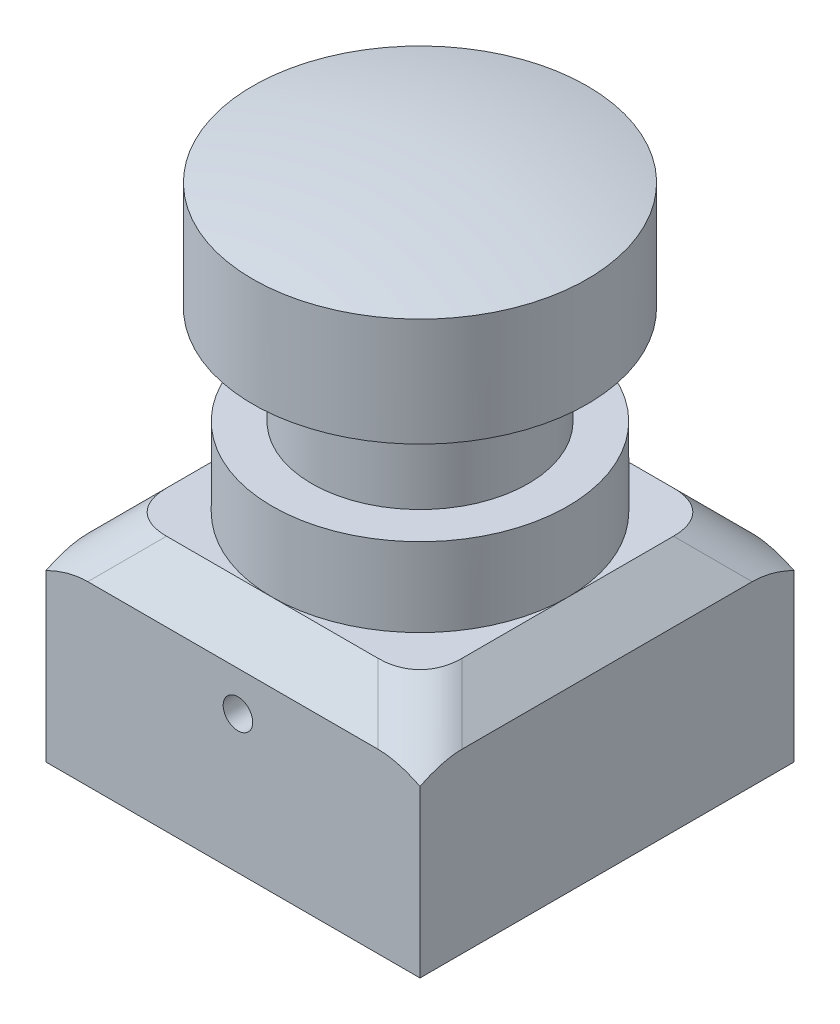
ISO-10303-21;
HEADER;
FILE_DESCRIPTION(('STEP AP214'),'2;1');
FILE_NAME('part.step','',(''),(''),'','','');
FILE_SCHEMA(('AUTOMOTIVE_DESIGN { 1 0 10303 214 1 1 1 1 }'));
ENDSEC;
DATA;
#1=APPLICATION_CONTEXT('core data for automotive mechanical design processes');
#2=APPLICATION_PROTOCOL_DEFINITION('international standard','automotive_design',2000,#1);
#3=PRODUCT_CONTEXT('',#1,'mechanical');
#4=PRODUCT('Part','Part','',(#3));
#5=PRODUCT_RELATED_PRODUCT_CATEGORY('part','',(#4));
#6=PRODUCT_DEFINITION_FORMATION('','',#4);
#7=PRODUCT_DEFINITION_CONTEXT('part definition',#1,'design');
#8=PRODUCT_DEFINITION('design','',#6,#7);
#9=PRODUCT_DEFINITION_SHAPE('','',#8);
#10=(LENGTH_UNIT() NAMED_UNIT(*) SI_UNIT(.MILLI.,.METRE.));
#11=(NAMED_UNIT(*) PLANE_ANGLE_UNIT() SI_UNIT($,.RADIAN.));
#12=(NAMED_UNIT(*) SI_UNIT($,.STERADIAN.) SOLID_ANGLE_UNIT());
#13=UNCERTAINTY_MEASURE_WITH_UNIT(LENGTH_MEASURE(1.E-05),#10,'distance_accuracy_value','');
#14=(GEOMETRIC_REPRESENTATION_CONTEXT(3) GLOBAL_UNCERTAINTY_ASSIGNED_CONTEXT((#13)) GLOBAL_UNIT_ASSIGNED_CONTEXT((#10,
#11,#12)) REPRESENTATION_CONTEXT('',''));
#15=CARTESIAN_POINT('',(0.,0.,0.));
#16=DIRECTION('',(0.,0.,1.));
#17=DIRECTION('',(1.,0.,0.));
#18=AXIS2_PLACEMENT_3D('',#15,#16,#17);
#19=CARTESIAN_POINT('',(0.,11.,0.));
#20=DIRECTION('',(0.,1.,0.));
#21=DIRECTION('',(0.,0.,1.));
#22=AXIS2_PLACEMENT_3D('',#19,#20,#21);
#23=PLANE('',#22);
#24=CARTESIAN_POINT('',(-1.64876033057851,11.,-2.19834710743802));
#25=DIRECTION('',(0.,1.,0.));
#26=DIRECTION('',(0.,0.,1.));
#27=AXIS2_PLACEMENT_3D('',#24,#25,#26);
#28=CIRCLE('',#27,7.5);
#29=CARTESIAN_POINT('',(-1.6487603305785,11.,5.30165289256198));
#30=VERTEX_POINT('',#29);
#31=CARTESIAN_POINT('',(5.85123966942149,11.,-2.19834710743802));
#32=VERTEX_POINT('',#31);
#33=EDGE_CURVE('E178',#30,#32,#28,.T.);
#34=ORIENTED_EDGE('',*,*,#33,.F.);
#35=DIRECTION('',(-1.,0.,0.));
#36=VECTOR('',#35,1.);
#37=CARTESIAN_POINT('',(0.,11.,5.30165289256197));
#38=LINE('',#37,#36);
#39=CARTESIAN_POINT('',(3.72991932586185,11.,5.30165289256197));
#40=VERTEX_POINT('',#39);
#41=EDGE_CURVE('E158',#40,#30,#38,.T.);
#42=ORIENTED_EDGE('',*,*,#41,.F.);
#43=CARTESIAN_POINT('',(1.6085989823022,11.,1.05901220544268));
#44=DIRECTION('',(0.,1.,0.));
#45=DIRECTION('',(0.707106781186548,0.,0.707106781186547));
#46=AXIS2_PLACEMENT_3D('',#43,#44,#45);
#47=ELLIPSE('',#46,5.19615242270664,3.);
#48=CARTESIAN_POINT('',(5.85123966942149,11.,3.18033254900233));
#49=VERTEX_POINT('',#48);
#50=EDGE_CURVE('E252',#40,#49,#47,.T.);
#51=ORIENTED_EDGE('',*,*,#50,.T.);
#52=DIRECTION('',(0.,0.,1.));
#53=VECTOR('',#52,1.);
#54=CARTESIAN_POINT('',(5.85123966942149,11.,0.));
#55=LINE('',#54,#53);
#56=EDGE_CURVE('E179',#32,#49,#55,.T.);
#57=ORIENTED_EDGE('',*,*,#56,.F.);
#58=EDGE_LOOP('',(#34,#42,#51,#57));
#59=FACE_BOUND('',#58,.T.);
#60=ADVANCED_FACE('F53',(#59),#23,.T.);
#61=CARTESIAN_POINT('',(-1.64876033057851,11.,-9.69834710743801));
#62=VERTEX_POINT('',#61);
#63=EDGE_CURVE('E62',#32,#62,#28,.T.);
#64=ORIENTED_EDGE('',*,*,#63,.F.);
#65=CARTESIAN_POINT('',(5.85123966942149,11.,-7.57702676387837));
#66=VERTEX_POINT('',#65);
#67=EDGE_CURVE('E195',#66,#32,#55,.T.);
#68=ORIENTED_EDGE('',*,*,#67,.F.);
#69=CARTESIAN_POINT('',(1.6085989823022,11.,-5.45570642031872));
#70=DIRECTION('',(0.,1.,0.));
#71=DIRECTION('',(0.707106781186547,0.,-0.707106781186548));
#72=AXIS2_PLACEMENT_3D('',#69,#70,#71);
#73=ELLIPSE('',#72,5.19615242270664,3.);
#74=CARTESIAN_POINT('',(3.72991932586185,11.,-9.69834710743801));
#75=VERTEX_POINT('',#74);
#76=EDGE_CURVE('E255',#66,#75,#73,.T.);
#77=ORIENTED_EDGE('',*,*,#76,.T.);
#78=DIRECTION('',(1.,0.,0.));
#79=VECTOR('',#78,1.);
#80=CARTESIAN_POINT('',(0.,11.,-9.69834710743801));
#81=LINE('',#80,#79);
#82=EDGE_CURVE('E197',#62,#75,#81,.T.);
#83=ORIENTED_EDGE('',*,*,#82,.F.);
#84=EDGE_LOOP('',(#64,#68,#77,#83));
#85=FACE_BOUND('',#84,.T.);
#86=ADVANCED_FACE('F293',(#85),#23,.T.);
#87=CARTESIAN_POINT('',(-9.1487603305785,11.,-2.19834710743802));
#88=VERTEX_POINT('',#87);
#89=EDGE_CURVE('E188',#62,#88,#28,.T.);
#90=ORIENTED_EDGE('',*,*,#89,.F.);
#91=CARTESIAN_POINT('',(-7.02743998701886,11.,-9.69834710743801));
#92=VERTEX_POINT('',#91);
#93=EDGE_CURVE('E198',#92,#62,#81,.T.);
#94=ORIENTED_EDGE('',*,*,#93,.F.);
#95=CARTESIAN_POINT('',(-4.9061196434592,11.,-5.45570642031872));
#96=DIRECTION('',(0.,1.,0.));
#97=DIRECTION('',(-0.707106781186548,0.,-0.707106781186548));
#98=AXIS2_PLACEMENT_3D('',#95,#96,#97);
#99=ELLIPSE('',#98,5.19615242270664,3.);
#100=CARTESIAN_POINT('',(-9.1487603305785,11.,-7.57702676387837));
#101=VERTEX_POINT('',#100);
#102=EDGE_CURVE('E258',#92,#101,#99,.T.);
#103=ORIENTED_EDGE('',*,*,#102,.T.);
#104=DIRECTION('',(0.,0.,-1.));
#105=VECTOR('',#104,1.);
#106=CARTESIAN_POINT('',(-9.1487603305785,11.,0.));
#107=LINE('',#106,#105);
#108=EDGE_CURVE('E201',#88,#101,#107,.T.);
#109=ORIENTED_EDGE('',*,*,#108,.F.);
#110=EDGE_LOOP('',(#90,#94,#103,#109));
#111=FACE_BOUND('',#110,.T.);
#112=ADVANCED_FACE('F308',(#111),#23,.T.);
#113=CARTESIAN_POINT('',(-11.1487603305785,9.,-11.698347107438));
#114=DIRECTION('',(1.,0.,0.));
#115=DIRECTION('',(0.,0.,-1.));
#116=AXIS2_PLACEMENT_3D('',#113,#114,#115);
#117=PLANE('',#116);
#118=DIRECTION('',(0.,0.,1.));
#119=VECTOR('',#118,1.);
#120=CARTESIAN_POINT('',(-11.1487603305785,9.,-11.698347107438));
#121=LINE('',#120,#119);
#122=CARTESIAN_POINT('',(-11.1487603305785,9.,-9.57702676387838));
#123=VERTEX_POINT('',#122);
#124=CARTESIAN_POINT('',(-11.1487603305785,9.,5.18033254900234));
#125=VERTEX_POINT('',#124);
#126=EDGE_CURVE('E204',#123,#125,#121,.T.);
#127=ORIENTED_EDGE('',*,*,#126,.F.);
#128=CARTESIAN_POINT('',(-11.1487603305785,4.75735931288072,-11.698347107438));
#129=DIRECTION('',(1.,0.,0.));
#130=DIRECTION('',(0.,-0.707106781186546,-0.707106781186549));
#131=AXIS2_PLACEMENT_3D('',#128,#129,#130);
#132=ELLIPSE('',#131,5.19615242270663,3.);
#133=CARTESIAN_POINT('',(-11.1487603305785,8.43159392705548,-11.698347107438));
#134=VERTEX_POINT('',#133);
#135=EDGE_CURVE('E241',#123,#134,#132,.F.);
#136=ORIENTED_EDGE('',*,*,#135,.T.);
#137=DIRECTION('',(0.,-1.,0.));
#138=VECTOR('',#137,1.);
#139=CARTESIAN_POINT('',(-11.1487603305785,9.,-11.698347107438));
#140=LINE('',#139,#138);
#141=CARTESIAN_POINT('',(-11.1487603305785,0.,-11.698347107438));
#142=VERTEX_POINT('',#141);
#143=EDGE_CURVE('E216',#134,#142,#140,.T.);
#144=ORIENTED_EDGE('',*,*,#143,.T.);
#145=DIRECTION('',(0.,0.,1.));
#146=VECTOR('',#145,1.);
#147=CARTESIAN_POINT('',(-11.1487603305785,0.,-11.698347107438));
#148=LINE('',#147,#146);
#149=CARTESIAN_POINT('',(-11.1487603305785,0.,7.30165289256198));
#150=VERTEX_POINT('',#149);
#151=EDGE_CURVE('E170',#142,#150,#148,.T.);
#152=ORIENTED_EDGE('',*,*,#151,.T.);
#153=DIRECTION('',(0.,-1.,0.));
#154=VECTOR('',#153,1.);
#155=CARTESIAN_POINT('',(-11.1487603305785,9.,7.30165289256198));
#156=LINE('',#155,#154);
#157=CARTESIAN_POINT('',(-11.1487603305785,8.43159392705548,7.30165289256198));
#158=VERTEX_POINT('',#157);
#159=EDGE_CURVE('E232',#158,#150,#156,.T.);
#160=ORIENTED_EDGE('',*,*,#159,.F.);
#161=CARTESIAN_POINT('',(-11.1487603305785,4.75735931288072,7.30165289256198));
#162=DIRECTION('',(1.,0.,0.));
#163=DIRECTION('',(0.,-0.707106781186546,0.707106781186549));
#164=AXIS2_PLACEMENT_3D('',#161,#162,#163);
#165=ELLIPSE('',#164,5.19615242270663,3.);
#166=EDGE_CURVE('E239',#158,#125,#165,.F.);
#167=ORIENTED_EDGE('',*,*,#166,.T.);
#168=EDGE_LOOP('',(#127,#136,#144,#152,#160,#167));
#169=FACE_BOUND('',#168,.T.);
#170=ADVANCED_FACE('F319',(#169),#117,.F.);
#171=CARTESIAN_POINT('',(-11.1487603305785,9.,7.30165289256198));
#172=DIRECTION('',(0.,0.,-1.));
#173=DIRECTION('',(-1.,0.,0.));
#174=AXIS2_PLACEMENT_3D('',#171,#172,#173);
#175=PLANE('',#174);
#176=CARTESIAN_POINT('',(-1.3987603305785,7.,7.30165289256198));
#177=DIRECTION('',(0.,0.,1.));
#178=DIRECTION('',(1.,0.,0.));
#179=AXIS2_PLACEMENT_3D('',#176,#177,#178);
#180=CIRCLE('',#179,0.75);
#181=CARTESIAN_POINT('',(-0.648760330578502,7.,7.30165289256198));
#182=VERTEX_POINT('',#181);
#183=EDGE_CURVE('E526',#182,#182,#180,.T.);
#184=ORIENTED_EDGE('',*,*,#183,.F.);
#185=EDGE_LOOP('',(#184));
#186=FACE_BOUND('',#185,.T.);
#187=DIRECTION('',(1.,0.,0.));
#188=VECTOR('',#187,1.);
#189=CARTESIAN_POINT('',(-11.1487603305785,9.,7.30165289256198));
#190=LINE('',#189,#188);
#191=CARTESIAN_POINT('',(-9.02743998701886,9.,7.30165289256198));
#192=VERTEX_POINT('',#191);
#193=CARTESIAN_POINT('',(5.72991932586186,9.,7.30165289256198));
#194=VERTEX_POINT('',#193);
#195=EDGE_CURVE('E207',#192,#194,#190,.T.);
#196=ORIENTED_EDGE('',*,*,#195,.F.);
#197=CARTESIAN_POINT('',(-11.1487603305785,4.75735931288072,7.30165289256198));
#198=DIRECTION('',(0.,0.,-1.));
#199=DIRECTION('',(-0.707106781186549,-0.707106781186546,0.));
#200=AXIS2_PLACEMENT_3D('',#197,#198,#199);
#201=ELLIPSE('',#200,5.19615242270663,3.);
#202=EDGE_CURVE('E189',#192,#158,#201,.F.);
#203=ORIENTED_EDGE('',*,*,#202,.T.);
#204=ORIENTED_EDGE('',*,*,#159,.T.);
#205=DIRECTION('',(1.,0.,0.));
#206=VECTOR('',#205,1.);
#207=CARTESIAN_POINT('',(-11.1487603305785,0.,7.30165289256198));
#208=LINE('',#207,#206);
#209=CARTESIAN_POINT('',(7.8512396694215,0.,7.30165289256198));
#210=VERTEX_POINT('',#209);
#211=EDGE_CURVE('E219',#150,#210,#208,.T.);
#212=ORIENTED_EDGE('',*,*,#211,.T.);
#213=DIRECTION('',(0.,-1.,0.));
#214=VECTOR('',#213,1.);
#215=CARTESIAN_POINT('',(7.8512396694215,9.,7.30165289256198));
#216=LINE('',#215,#214);
#217=CARTESIAN_POINT('',(7.8512396694215,8.43159392705549,7.30165289256198));
#218=VERTEX_POINT('',#217);
#219=EDGE_CURVE('E230',#218,#210,#216,.T.);
#220=ORIENTED_EDGE('',*,*,#219,.F.);
#221=CARTESIAN_POINT('',(7.8512396694215,4.75735931288072,7.30165289256198));
#222=DIRECTION('',(0.,0.,-1.));
#223=DIRECTION('',(0.707106781186549,-0.707106781186546,0.));
#224=AXIS2_PLACEMENT_3D('',#221,#222,#223);
#225=ELLIPSE('',#224,5.19615242270663,3.);
#226=EDGE_CURVE('E190',#218,#194,#225,.F.);
#227=ORIENTED_EDGE('',*,*,#226,.T.);
#228=EDGE_LOOP('',(#196,#203,#204,#212,#220,#227));
#229=FACE_BOUND('',#228,.T.);
#230=ADVANCED_FACE('F277',(#186,#229),#175,.F.);
#231=CARTESIAN_POINT('',(7.8512396694215,9.,-11.698347107438));
#232=DIRECTION('',(-1.,0.,0.));
#233=DIRECTION('',(0.,0.,1.));
#234=AXIS2_PLACEMENT_3D('',#231,#232,#233);
#235=PLANE('',#234);
#236=DIRECTION('',(0.,-1.,0.));
#237=VECTOR('',#236,1.);
#238=CARTESIAN_POINT('',(7.8512396694215,9.,-11.698347107438));
#239=LINE('',#238,#237);
#240=CARTESIAN_POINT('',(7.8512396694215,8.43159392705549,-11.698347107438));
#241=VERTEX_POINT('',#240);
#242=CARTESIAN_POINT('',(7.8512396694215,0.,-11.698347107438));
#243=VERTEX_POINT('',#242);
#244=EDGE_CURVE('E228',#241,#243,#239,.T.);
#245=ORIENTED_EDGE('',*,*,#244,.F.);
#246=CARTESIAN_POINT('',(7.8512396694215,4.75735931288072,-11.698347107438));
#247=DIRECTION('',(-1.,0.,0.));
#248=DIRECTION('',(0.,-0.707106781186546,-0.707106781186549));
#249=AXIS2_PLACEMENT_3D('',#246,#247,#248);
#250=ELLIPSE('',#249,5.19615242270663,3.);
#251=CARTESIAN_POINT('',(7.8512396694215,9.,-9.57702676387838));
#252=VERTEX_POINT('',#251);
#253=EDGE_CURVE('E263',#241,#252,#250,.F.);
#254=ORIENTED_EDGE('',*,*,#253,.T.);
#255=DIRECTION('',(0.,0.,-1.));
#256=VECTOR('',#255,1.);
#257=CARTESIAN_POINT('',(7.8512396694215,9.,-11.698347107438));
#258=LINE('',#257,#256);
#259=CARTESIAN_POINT('',(7.8512396694215,9.,5.18033254900234));
#260=VERTEX_POINT('',#259);
#261=EDGE_CURVE('E210',#260,#252,#258,.T.);
#262=ORIENTED_EDGE('',*,*,#261,.F.);
#263=CARTESIAN_POINT('',(7.8512396694215,4.75735931288072,7.30165289256198));
#264=DIRECTION('',(-1.,0.,0.));
#265=DIRECTION('',(0.,-0.707106781186546,0.707106781186549));
#266=AXIS2_PLACEMENT_3D('',#263,#264,#265);
#267=ELLIPSE('',#266,5.19615242270663,3.);
#268=EDGE_CURVE('E261',#260,#218,#267,.F.);
#269=ORIENTED_EDGE('',*,*,#268,.T.);
#270=ORIENTED_EDGE('',*,*,#219,.T.);
#271=DIRECTION('',(0.,0.,-1.));
#272=VECTOR('',#271,1.);
#273=CARTESIAN_POINT('',(7.8512396694215,0.,-11.698347107438));
#274=LINE('',#273,#272);
#275=EDGE_CURVE('E222',#210,#243,#274,.T.);
#276=ORIENTED_EDGE('',*,*,#275,.T.);
#277=EDGE_LOOP('',(#245,#254,#262,#269,#270,#276));
#278=FACE_BOUND('',#277,.T.);
#279=ADVANCED_FACE('F287',(#278),#235,.F.);
#280=CARTESIAN_POINT('',(-11.1487603305785,9.,-11.698347107438));
#281=DIRECTION('',(0.,0.,1.));
#282=DIRECTION('',(1.,0.,0.));
#283=AXIS2_PLACEMENT_3D('',#280,#281,#282);
#284=PLANE('',#283);
#285=CARTESIAN_POINT('',(-1.3987603305785,7.,-11.698347107438));
#286=DIRECTION('',(0.,0.,1.));
#287=DIRECTION('',(1.,0.,0.));
#288=AXIS2_PLACEMENT_3D('',#285,#286,#287);
#289=CIRCLE('',#288,0.75);
#290=CARTESIAN_POINT('',(-0.648760330578502,7.,-11.698347107438));
#291=VERTEX_POINT('',#290);
#292=EDGE_CURVE('E527',#291,#291,#289,.T.);
#293=ORIENTED_EDGE('',*,*,#292,.T.);
#294=EDGE_LOOP('',(#293));
#295=FACE_BOUND('',#294,.T.);
#296=ORIENTED_EDGE('',*,*,#143,.F.);
#297=CARTESIAN_POINT('',(-11.1487603305785,4.75735931288072,-11.698347107438));
#298=DIRECTION('',(0.,0.,1.));
#299=DIRECTION('',(-0.707106781186549,-0.707106781186546,0.));
#300=AXIS2_PLACEMENT_3D('',#297,#298,#299);
#301=ELLIPSE('',#300,5.19615242270663,3.);
#302=CARTESIAN_POINT('',(-9.02743998701886,9.,-11.698347107438));
#303=VERTEX_POINT('',#302);
#304=EDGE_CURVE('E245',#134,#303,#301,.F.);
#305=ORIENTED_EDGE('',*,*,#304,.T.);
#306=DIRECTION('',(-1.,0.,0.));
#307=VECTOR('',#306,1.);
#308=CARTESIAN_POINT('',(-11.1487603305785,9.,-11.698347107438));
#309=LINE('',#308,#307);
#310=CARTESIAN_POINT('',(5.72991932586186,9.,-11.698347107438));
#311=VERTEX_POINT('',#310);
#312=EDGE_CURVE('E213',#311,#303,#309,.T.);
#313=ORIENTED_EDGE('',*,*,#312,.F.);
#314=CARTESIAN_POINT('',(7.8512396694215,4.75735931288072,-11.698347107438));
#315=DIRECTION('',(0.,0.,1.));
#316=DIRECTION('',(0.707106781186549,-0.707106781186546,0.));
#317=AXIS2_PLACEMENT_3D('',#314,#315,#316);
#318=ELLIPSE('',#317,5.19615242270663,3.);
#319=EDGE_CURVE('E243',#311,#241,#318,.F.);
#320=ORIENTED_EDGE('',*,*,#319,.T.);
#321=ORIENTED_EDGE('',*,*,#244,.T.);
#322=DIRECTION('',(-1.,0.,0.));
#323=VECTOR('',#322,1.);
#324=CARTESIAN_POINT('',(-11.1487603305785,0.,-11.698347107438));
#325=LINE('',#324,#323);
#326=EDGE_CURVE('E208',#243,#142,#325,.T.);
#327=ORIENTED_EDGE('',*,*,#326,.T.);
#328=EDGE_LOOP('',(#296,#305,#313,#320,#321,#327));
#329=FACE_BOUND('',#328,.T.);
#330=ADVANCED_FACE('F300',(#295,#329),#284,.F.);
#331=CARTESIAN_POINT('',(0.,0.,0.));
#332=DIRECTION('',(0.,1.,0.));
#333=DIRECTION('',(0.,0.,1.));
#334=AXIS2_PLACEMENT_3D('',#331,#332,#333);
#335=PLANE('',#334);
#336=ORIENTED_EDGE('',*,*,#151,.F.);
#337=ORIENTED_EDGE('',*,*,#326,.F.);
#338=ORIENTED_EDGE('',*,*,#275,.F.);
#339=ORIENTED_EDGE('',*,*,#211,.F.);
#340=EDGE_LOOP('',(#336,#337,#338,#339));
#341=FACE_BOUND('',#340,.T.);
#342=ADVANCED_FACE('F323',(#341),#335,.F.);
#343=CARTESIAN_POINT('',(7.8512396694215,9.,0.));
#344=DIRECTION('',(0.707106781186546,0.707106781186549,0.));
#345=DIRECTION('',(-0.707106781186549,0.707106781186546,0.));
#346=AXIS2_PLACEMENT_3D('',#343,#344,#345);
#347=PLANE('',#346);
#348=ORIENTED_EDGE('',*,*,#261,.T.);
#349=DIRECTION('',(0.577350269189626,-0.577350269189625,-0.577350269189627));
#350=VECTOR('',#349,1.);
#351=CARTESIAN_POINT('',(4.65889741479536,12.1923422546261,-6.38468450925225));
#352=LINE('',#351,#350);
#353=EDGE_CURVE('E268',#252,#66,#352,.F.);
#354=ORIENTED_EDGE('',*,*,#353,.T.);
#355=ORIENTED_EDGE('',*,*,#67,.T.);
#356=ORIENTED_EDGE('',*,*,#56,.T.);
#357=DIRECTION('',(0.577350269189627,-0.577350269189624,0.577350269189626));
#358=VECTOR('',#357,1.);
#359=CARTESIAN_POINT('',(6.12446215308738,10.7267775163341,3.45355503266822));
#360=LINE('',#359,#358);
#361=EDGE_CURVE('E265',#49,#260,#360,.T.);
#362=ORIENTED_EDGE('',*,*,#361,.T.);
#363=EDGE_LOOP('',(#348,#354,#355,#356,#362));
#364=FACE_BOUND('',#363,.T.);
#365=ADVANCED_FACE('F283',(#364),#347,.T.);
#366=CARTESIAN_POINT('',(0.,9.,-11.698347107438));
#367=DIRECTION('',(0.,0.707106781186549,-0.707106781186546));
#368=DIRECTION('',(0.,0.707106781186546,0.707106781186549));
#369=AXIS2_PLACEMENT_3D('',#366,#367,#368);
#370=PLANE('',#369);
#371=ORIENTED_EDGE('',*,*,#312,.T.);
#372=DIRECTION('',(-0.577350269189627,-0.577350269189624,-0.577350269189627));
#373=VECTOR('',#372,1.);
#374=CARTESIAN_POINT('',(-6.01829332467924,12.0091466623396,-8.68920044509839));
#375=LINE('',#374,#373);
#376=EDGE_CURVE('E250',#303,#92,#375,.F.);
#377=ORIENTED_EDGE('',*,*,#376,.T.);
#378=ORIENTED_EDGE('',*,*,#93,.T.);
#379=ORIENTED_EDGE('',*,*,#82,.T.);
#380=DIRECTION('',(0.577350269189626,-0.577350269189624,-0.577350269189627));
#381=VECTOR('',#380,1.);
#382=CARTESIAN_POINT('',(3.81994621724124,10.9099731086206,-9.7883739988174));
#383=LINE('',#382,#381);
#384=EDGE_CURVE('E247',#75,#311,#383,.T.);
#385=ORIENTED_EDGE('',*,*,#384,.T.);
#386=EDGE_LOOP('',(#371,#377,#378,#379,#385));
#387=FACE_BOUND('',#386,.T.);
#388=ADVANCED_FACE('F296',(#387),#370,.T.);
#389=CARTESIAN_POINT('',(-11.1487603305785,9.,0.));
#390=DIRECTION('',(-0.707106781186546,0.707106781186549,0.));
#391=DIRECTION('',(-0.707106781186549,-0.707106781186546,0.));
#392=AXIS2_PLACEMENT_3D('',#389,#390,#391);
#393=PLANE('',#392);
#394=CARTESIAN_POINT('',(-9.1487603305785,11.,3.18033254900234));
#395=VERTEX_POINT('',#394);
#396=EDGE_CURVE('E176',#395,#88,#107,.T.);
#397=ORIENTED_EDGE('',*,*,#396,.T.);
#398=ORIENTED_EDGE('',*,*,#108,.T.);
#399=DIRECTION('',(-0.577350269189627,-0.577350269189624,-0.577350269189627));
#400=VECTOR('',#399,1.);
#401=CARTESIAN_POINT('',(-7.95641807595237,12.1923422546261,-6.38468450925225));
#402=LINE('',#401,#400);
#403=EDGE_CURVE('E236',#101,#123,#402,.T.);
#404=ORIENTED_EDGE('',*,*,#403,.T.);
#405=ORIENTED_EDGE('',*,*,#126,.T.);
#406=DIRECTION('',(-0.577350269189627,-0.577350269189624,0.577350269189627));
#407=VECTOR('',#406,1.);
#408=CARTESIAN_POINT('',(-9.42198281424438,10.7267775163341,3.45355503266822));
#409=LINE('',#408,#407);
#410=EDGE_CURVE('E234',#125,#395,#409,.F.);
#411=ORIENTED_EDGE('',*,*,#410,.T.);
#412=EDGE_LOOP('',(#397,#398,#404,#405,#411));
#413=FACE_BOUND('',#412,.T.);
#414=ADVANCED_FACE('F310',(#413),#393,.T.);
#415=CARTESIAN_POINT('',(0.,9.,7.30165289256198));
#416=DIRECTION('',(0.,0.707106781186549,0.707106781186546));
#417=DIRECTION('',(0.,-0.707106781186546,0.707106781186549));
#418=AXIS2_PLACEMENT_3D('',#415,#416,#417);
#419=PLANE('',#418);
#420=ORIENTED_EDGE('',*,*,#41,.T.);
#421=CARTESIAN_POINT('',(-7.02743998701885,11.,5.30165289256197));
#422=VERTEX_POINT('',#421);
#423=EDGE_CURVE('E161',#30,#422,#38,.T.);
#424=ORIENTED_EDGE('',*,*,#423,.T.);
#425=DIRECTION('',(-0.577350269189626,-0.577350269189624,0.577350269189627));
#426=VECTOR('',#425,1.);
#427=CARTESIAN_POINT('',(-6.01829332467924,12.0091466623396,4.29250623022235));
#428=LINE('',#427,#426);
#429=EDGE_CURVE('E271',#422,#192,#428,.T.);
#430=ORIENTED_EDGE('',*,*,#429,.T.);
#431=ORIENTED_EDGE('',*,*,#195,.T.);
#432=DIRECTION('',(0.577350269189627,-0.577350269189624,0.577350269189626));
#433=VECTOR('',#432,1.);
#434=CARTESIAN_POINT('',(3.81994621724124,10.9099731086206,5.39167978394136));
#435=LINE('',#434,#433);
#436=EDGE_CURVE('E165',#194,#40,#435,.F.);
#437=ORIENTED_EDGE('',*,*,#436,.T.);
#438=EDGE_LOOP('',(#420,#424,#430,#431,#437));
#439=FACE_BOUND('',#438,.T.);
#440=ADVANCED_FACE('F159',(#439),#419,.T.);
#441=EDGE_CURVE('E77',#88,#30,#28,.T.);
#442=ORIENTED_EDGE('',*,*,#441,.F.);
#443=ORIENTED_EDGE('',*,*,#396,.F.);
#444=CARTESIAN_POINT('',(-4.9061196434592,11.,1.05901220544268));
#445=DIRECTION('',(0.,1.,0.));
#446=DIRECTION('',(-0.707106781186547,0.,0.707106781186548));
#447=AXIS2_PLACEMENT_3D('',#444,#445,#446);
#448=ELLIPSE('',#447,5.19615242270664,3.);
#449=EDGE_CURVE('E174',#395,#422,#448,.T.);
#450=ORIENTED_EDGE('',*,*,#449,.T.);
#451=ORIENTED_EDGE('',*,*,#423,.F.);
#452=EDGE_LOOP('',(#442,#443,#450,#451));
#453=FACE_BOUND('',#452,.T.);
#454=ADVANCED_FACE('F172',(#453),#23,.T.);
#455=CARTESIAN_POINT('',(-5.83509773239273,10.0710219110665,-6.38468450925225));
#456=DIRECTION('',(-0.577350269189627,-0.577350269189624,-0.577350269189627));
#457=DIRECTION('',(-0.707106781186547,0.,0.707106781186547));
#458=AXIS2_PLACEMENT_3D('',#455,#456,#457);
#459=CYLINDRICAL_SURFACE('',#458,3.);
#460=ORIENTED_EDGE('',*,*,#102,.F.);
#461=ORIENTED_EDGE('',*,*,#376,.F.);
#462=ORIENTED_EDGE('',*,*,#304,.F.);
#463=ORIENTED_EDGE('',*,*,#135,.F.);
#464=ORIENTED_EDGE('',*,*,#403,.F.);
#465=EDGE_LOOP('',(#460,#461,#462,#463,#464));
#466=FACE_BOUND('',#465,.T.);
#467=ADVANCED_FACE('F304',(#466),#459,.T.);
#468=CARTESIAN_POINT('',(3.81994621724123,8.78865276506097,-7.66705365525776));
#469=DIRECTION('',(0.577350269189626,-0.577350269189624,-0.577350269189627));
#470=DIRECTION('',(-0.707106781186548,0.,-0.707106781186547));
#471=AXIS2_PLACEMENT_3D('',#468,#469,#470);
#472=CYLINDRICAL_SURFACE('',#471,3.);
#473=ORIENTED_EDGE('',*,*,#76,.F.);
#474=ORIENTED_EDGE('',*,*,#353,.F.);
#475=ORIENTED_EDGE('',*,*,#253,.F.);
#476=ORIENTED_EDGE('',*,*,#319,.F.);
#477=ORIENTED_EDGE('',*,*,#384,.F.);
#478=EDGE_LOOP('',(#473,#474,#475,#476,#477));
#479=FACE_BOUND('',#478,.T.);
#480=ADVANCED_FACE('F291',(#479),#472,.T.);
#481=CARTESIAN_POINT('',(-6.01829332467923,9.88782631877997,2.17118588666271));
#482=DIRECTION('',(-0.577350269189626,-0.577350269189624,0.577350269189627));
#483=DIRECTION('',(0.707106781186548,0.,0.707106781186547));
#484=AXIS2_PLACEMENT_3D('',#481,#482,#483);
#485=CYLINDRICAL_SURFACE('',#484,3.);
#486=ORIENTED_EDGE('',*,*,#449,.F.);
#487=ORIENTED_EDGE('',*,*,#410,.F.);
#488=ORIENTED_EDGE('',*,*,#166,.F.);
#489=ORIENTED_EDGE('',*,*,#202,.F.);
#490=ORIENTED_EDGE('',*,*,#429,.F.);
#491=EDGE_LOOP('',(#486,#487,#488,#489,#490));
#492=FACE_BOUND('',#491,.T.);
#493=ADVANCED_FACE('F313',(#492),#485,.T.);
#494=CARTESIAN_POINT('',(4.00314180952774,8.60545717277446,3.45355503266822));
#495=DIRECTION('',(0.577350269189627,-0.577350269189624,0.577350269189626));
#496=DIRECTION('',(0.707106781186547,0.,-0.707106781186548));
#497=AXIS2_PLACEMENT_3D('',#494,#495,#496);
#498=CYLINDRICAL_SURFACE('',#497,3.);
#499=ORIENTED_EDGE('',*,*,#50,.F.);
#500=ORIENTED_EDGE('',*,*,#436,.F.);
#501=ORIENTED_EDGE('',*,*,#226,.F.);
#502=ORIENTED_EDGE('',*,*,#268,.F.);
#503=ORIENTED_EDGE('',*,*,#361,.F.);
#504=EDGE_LOOP('',(#499,#500,#501,#502,#503));
#505=FACE_BOUND('',#504,.T.);
#506=ADVANCED_FACE('F279',(#505),#498,.T.);
#507=CARTESIAN_POINT('',(-1.64876033057851,51.2132034355964,-2.19834710743802));
#508=DIRECTION('',(0.,-1.,0.));
#509=DIRECTION('',(0.,0.,-1.));
#510=AXIS2_PLACEMENT_3D('',#507,#508,#509);
#511=CYLINDRICAL_SURFACE('',#510,7.5);
#512=ORIENTED_EDGE('',*,*,#33,.T.);
#513=ORIENTED_EDGE('',*,*,#63,.T.);
#514=ORIENTED_EDGE('',*,*,#89,.T.);
#515=ORIENTED_EDGE('',*,*,#441,.T.);
#516=EDGE_LOOP('',(#512,#513,#514,#515));
#517=FACE_BOUND('',#516,.T.);
#518=CARTESIAN_POINT('',(-1.64876033057851,15.,-2.19834710743802));
#519=DIRECTION('',(0.,1.,0.));
#520=DIRECTION('',(0.,0.,1.));
#521=AXIS2_PLACEMENT_3D('',#518,#519,#520);
#522=CIRCLE('',#521,7.5);
#523=CARTESIAN_POINT('',(-1.64876033057851,15.,5.30165289256198));
#524=VERTEX_POINT('',#523);
#525=EDGE_CURVE('E182',#524,#524,#522,.T.);
#526=ORIENTED_EDGE('',*,*,#525,.F.);
#527=EDGE_LOOP('',(#526));
#528=FACE_BOUND('',#527,.T.);
#529=ADVANCED_FACE('F186',(#517,#528),#511,.T.);
#530=CARTESIAN_POINT('',(0.,15.,0.));
#531=DIRECTION('',(0.,1.,0.));
#532=DIRECTION('',(0.,0.,1.));
#533=AXIS2_PLACEMENT_3D('',#530,#531,#532);
#534=PLANE('',#533);
#535=CARTESIAN_POINT('',(-1.64876033057851,15.,-2.19834710743802));
#536=DIRECTION('',(0.,1.,0.));
#537=DIRECTION('',(0.,0.,1.));
#538=AXIS2_PLACEMENT_3D('',#535,#536,#537);
#539=CIRCLE('',#538,5.5);
#540=CARTESIAN_POINT('',(-1.64876033057851,15.,3.30165289256198));
#541=VERTEX_POINT('',#540);
#542=EDGE_CURVE('E12',#541,#541,#539,.T.);
#543=ORIENTED_EDGE('',*,*,#542,.F.);
#544=EDGE_LOOP('',(#543));
#545=FACE_BOUND('',#544,.T.);
#546=ORIENTED_EDGE('',*,*,#525,.T.);
#547=EDGE_LOOP('',(#546));
#548=FACE_BOUND('',#547,.T.);
#549=ADVANCED_FACE('F366',(#545,#548),#534,.T.);
#550=CARTESIAN_POINT('',(-1.64876033057851,55.556349186104,-2.19834710743802));
#551=DIRECTION('',(0.,-1.,0.));
#552=DIRECTION('',(0.,0.,-1.));
#553=AXIS2_PLACEMENT_3D('',#550,#551,#552);
#554=CYLINDRICAL_SURFACE('',#553,5.5);
#555=ORIENTED_EDGE('',*,*,#542,.T.);
#556=EDGE_LOOP('',(#555));
#557=FACE_BOUND('',#556,.T.);
#558=CARTESIAN_POINT('',(-1.64876033057851,20.,-2.19834710743802));
#559=DIRECTION('',(0.,1.,0.));
#560=DIRECTION('',(0.,0.,1.));
#561=AXIS2_PLACEMENT_3D('',#558,#559,#560);
#562=CIRCLE('',#561,5.5);
#563=CARTESIAN_POINT('',(-1.64876033057851,20.,3.30165289256198));
#564=VERTEX_POINT('',#563);
#565=EDGE_CURVE('E183',#564,#564,#562,.T.);
#566=ORIENTED_EDGE('',*,*,#565,.F.);
#567=EDGE_LOOP('',(#566));
#568=FACE_BOUND('',#567,.T.);
#569=ADVANCED_FACE('F371',(#557,#568),#554,.T.);
#570=CARTESIAN_POINT('',(-1.64876033057851,75.0416305603426,-2.19834710743802));
#571=DIRECTION('',(0.,-1.,0.));
#572=DIRECTION('',(0.,0.,-1.));
#573=AXIS2_PLACEMENT_3D('',#570,#571,#572);
#574=CYLINDRICAL_SURFACE('',#573,8.5);
#575=CARTESIAN_POINT('',(-1.64876033057851,20.,-2.19834710743802));
#576=DIRECTION('',(0.,1.,0.));
#577=DIRECTION('',(0.,0.,1.));
#578=AXIS2_PLACEMENT_3D('',#575,#576,#577);
#579=CIRCLE('',#578,8.5);
#580=CARTESIAN_POINT('',(-1.64876033057851,20.,-10.698347107438));
#581=VERTEX_POINT('',#580);
#582=EDGE_CURVE('E536',#581,#581,#579,.T.);
#583=CARTESIAN_POINT('',(-1.64876033057851,25.5,-2.19834710743802));
#584=DIRECTION('',(0.,1.,0.));
#585=DIRECTION('',(0.,0.,1.));
#586=AXIS2_PLACEMENT_3D('',#583,#584,#585);
#587=CIRCLE('',#586,8.5);
#588=CARTESIAN_POINT('',(-1.64876033057851,25.5,-10.698347107438));
#589=VERTEX_POINT('',#588);
#590=EDGE_CURVE('E57',#589,#589,#587,.T.);
#591=CARTESIAN_POINT('',(-1.64876033057851,20.,-10.698347107438));
#592=CARTESIAN_POINT('',(-1.64876033057851,20.0572916666667,-10.698347107438));
#593=CARTESIAN_POINT('',(-1.64876033057851,20.1145833333333,-10.698347107438));
#594=CARTESIAN_POINT('',(-1.64876033057851,20.2291666666667,-10.698347107438));
#595=CARTESIAN_POINT('',(-1.64876033057851,20.2864583333333,-10.698347107438));
#596=CARTESIAN_POINT('',(-1.64876033057851,20.4010416666667,-10.698347107438));
#597=CARTESIAN_POINT('',(-1.64876033057851,20.4583333333333,-10.698347107438));
#598=CARTESIAN_POINT('',(-1.64876033057851,20.5729166666667,-10.698347107438));
#599=CARTESIAN_POINT('',(-1.64876033057851,20.6302083333333,-10.698347107438));
#600=CARTESIAN_POINT('',(-1.64876033057851,20.7447916666667,-10.698347107438));
#601=CARTESIAN_POINT('',(-1.64876033057851,20.8020833333333,-10.698347107438));
#602=CARTESIAN_POINT('',(-1.64876033057851,20.9166666666667,-10.698347107438));
#603=CARTESIAN_POINT('',(-1.64876033057851,20.9739583333333,-10.698347107438));
#604=CARTESIAN_POINT('',(-1.64876033057851,21.0885416666667,-10.698347107438));
#605=CARTESIAN_POINT('',(-1.64876033057851,21.1458333333333,-10.698347107438));
#606=CARTESIAN_POINT('',(-1.64876033057851,21.2604166666667,-10.698347107438));
#607=CARTESIAN_POINT('',(-1.64876033057851,21.3177083333333,-10.698347107438));
#608=CARTESIAN_POINT('',(-1.64876033057851,21.4322916666667,-10.698347107438));
#609=CARTESIAN_POINT('',(-1.64876033057851,21.4895833333333,-10.698347107438));
#610=CARTESIAN_POINT('',(-1.64876033057851,21.6041666666667,-10.698347107438));
#611=CARTESIAN_POINT('',(-1.64876033057851,21.6614583333333,-10.698347107438));
#612=CARTESIAN_POINT('',(-1.64876033057851,21.7760416666667,-10.698347107438));
#613=CARTESIAN_POINT('',(-1.64876033057851,21.8333333333333,-10.698347107438));
#614=CARTESIAN_POINT('',(-1.64876033057851,21.9479166666667,-10.698347107438));
#615=CARTESIAN_POINT('',(-1.64876033057851,22.0052083333333,-10.698347107438));
#616=CARTESIAN_POINT('',(-1.64876033057851,22.1197916666667,-10.698347107438));
#617=CARTESIAN_POINT('',(-1.64876033057851,22.1770833333333,-10.698347107438));
#618=CARTESIAN_POINT('',(-1.64876033057851,22.2916666666667,-10.698347107438));
#619=CARTESIAN_POINT('',(-1.64876033057851,22.3489583333333,-10.698347107438));
#620=CARTESIAN_POINT('',(-1.64876033057851,22.4635416666667,-10.698347107438));
#621=CARTESIAN_POINT('',(-1.64876033057851,22.5208333333333,-10.698347107438));
#622=CARTESIAN_POINT('',(-1.64876033057851,22.6354166666667,-10.698347107438));
#623=CARTESIAN_POINT('',(-1.64876033057851,22.6927083333333,-10.698347107438));
#624=CARTESIAN_POINT('',(-1.64876033057851,22.8072916666667,-10.698347107438));
#625=CARTESIAN_POINT('',(-1.64876033057851,22.8645833333333,-10.698347107438));
#626=CARTESIAN_POINT('',(-1.64876033057851,22.9791666666667,-10.698347107438));
#627=CARTESIAN_POINT('',(-1.64876033057851,23.0364583333333,-10.698347107438));
#628=CARTESIAN_POINT('',(-1.64876033057851,23.1510416666667,-10.698347107438));
#629=CARTESIAN_POINT('',(-1.64876033057851,23.2083333333333,-10.698347107438));
#630=CARTESIAN_POINT('',(-1.64876033057851,23.3229166666667,-10.698347107438));
#631=CARTESIAN_POINT('',(-1.64876033057851,23.3802083333333,-10.698347107438));
#632=CARTESIAN_POINT('',(-1.64876033057851,23.4947916666667,-10.698347107438));
#633=CARTESIAN_POINT('',(-1.64876033057851,23.5520833333333,-10.698347107438));
#634=CARTESIAN_POINT('',(-1.64876033057851,23.6666666666667,-10.698347107438));
#635=CARTESIAN_POINT('',(-1.64876033057851,23.7239583333333,-10.698347107438));
#636=CARTESIAN_POINT('',(-1.64876033057851,23.8385416666667,-10.698347107438));
#637=CARTESIAN_POINT('',(-1.64876033057851,23.8958333333333,-10.698347107438));
#638=CARTESIAN_POINT('',(-1.64876033057851,24.0104166666667,-10.698347107438));
#639=CARTESIAN_POINT('',(-1.64876033057851,24.0677083333333,-10.698347107438));
#640=CARTESIAN_POINT('',(-1.64876033057851,24.1822916666667,-10.698347107438));
#641=CARTESIAN_POINT('',(-1.64876033057851,24.2395833333333,-10.698347107438));
#642=CARTESIAN_POINT('',(-1.64876033057851,24.3541666666667,-10.698347107438));
#643=CARTESIAN_POINT('',(-1.64876033057851,24.4114583333333,-10.698347107438));
#644=CARTESIAN_POINT('',(-1.64876033057851,24.5260416666667,-10.698347107438));
#645=CARTESIAN_POINT('',(-1.64876033057851,24.5833333333333,-10.698347107438));
#646=CARTESIAN_POINT('',(-1.64876033057851,24.6979166666667,-10.698347107438));
#647=CARTESIAN_POINT('',(-1.64876033057851,24.7552083333333,-10.698347107438));
#648=CARTESIAN_POINT('',(-1.64876033057851,24.8697916666667,-10.698347107438));
#649=CARTESIAN_POINT('',(-1.64876033057851,24.9270833333333,-10.698347107438));
#650=CARTESIAN_POINT('',(-1.64876033057851,25.0416666666667,-10.698347107438));
#651=CARTESIAN_POINT('',(-1.64876033057851,25.0989583333333,-10.698347107438));
#652=CARTESIAN_POINT('',(-1.64876033057851,25.2135416666667,-10.698347107438));
#653=CARTESIAN_POINT('',(-1.64876033057851,25.2708333333333,-10.698347107438));
#654=CARTESIAN_POINT('',(-1.64876033057851,25.3854166666667,-10.698347107438));
#655=CARTESIAN_POINT('',(-1.64876033057851,25.4427083333333,-10.698347107438));
#656=CARTESIAN_POINT('',(-1.64876033057851,25.5,-10.698347107438));
#657=B_SPLINE_CURVE_WITH_KNOTS('',3,(#591,#592,#593,#594,#595,#596,#597,#598,#599,#600,#601,
#602,#603,#604,#605,#606,#607,#608,#609,#610,#611,#612,#613,#614,#615,#616,#617,#618,#619,#620,
#621,#622,#623,#624,#625,#626,#627,#628,#629,#630,#631,#632,#633,#634,#635,#636,#637,#638,#639,
#640,#641,#642,#643,#644,#645,#646,#647,#648,#649,#650,#651,#652,#653,#654,#655,#656),
.UNSPECIFIED.,.F.,.F.,(4,2,2,2,2,2,2,2,2,2,2,2,2,2,2,2,2,2,2,2,2,2,2,2,2,2,2,2,2,2,2,2,4),(0.,
0.171875000000002,0.343749999999997,0.515624999999999,0.687500000000001,0.859374999999996,
1.03125,1.203125,1.375,1.546875,1.71875,1.890625,2.06249999999999,2.234375,2.40625,
2.57812499999999,2.75,2.921875,3.09374999999999,3.26562499999999,3.4375,3.60937499999999,
3.78124999999999,3.95312499999999,4.12499999999999,4.29687499999999,4.46874999999999,4.640625,
4.81249999999999,4.98437499999999,5.15624999999999,5.32812499999999,5.49999999999999),.UNSPECIFIED.);
#658=EDGE_CURVE('BSEAM454',#581,#589,#657,.T.);
#659=ORIENTED_EDGE('',*,*,#582,.T.);
#660=ORIENTED_EDGE('',*,*,#590,.F.);
#661=ORIENTED_EDGE('',*,*,#658,.T.);
#662=ORIENTED_EDGE('',*,*,#658,.F.);
#663=EDGE_LOOP('',(#659,#661,#660,#662));
#664=FACE_BOUND('',#663,.T.);
#665=ADVANCED_FACE('F454',(#664),#574,.T.);
#666=CARTESIAN_POINT('',(-1.64876033057851,20.,-2.19834710743802));
#667=DIRECTION('',(0.,1.,0.));
#668=DIRECTION('',(0.,0.,1.));
#669=AXIS2_PLACEMENT_3D('',#666,#667,#668);
#670=PLANE('',#669);
#671=ORIENTED_EDGE('',*,*,#565,.T.);
#672=EDGE_LOOP('',(#671));
#673=FACE_BOUND('',#672,.T.);
#674=ORIENTED_EDGE('',*,*,#582,.F.);
#675=EDGE_LOOP('',(#674));
#676=FACE_BOUND('',#675,.T.);
#677=ADVANCED_FACE('F464',(#673,#676),#670,.F.);
#678=CARTESIAN_POINT('',(-1.64876033057851,-10.1250000000001,-2.19834710743802));
#679=DIRECTION('',(0.,0.,1.));
#680=DIRECTION('',(1.,0.,0.));
#681=AXIS2_PLACEMENT_3D('',#678,#679,#680);
#682=SPHERICAL_SURFACE('',#681,36.6250000000001);
#683=CARTESIAN_POINT('',(-1.64876033057851,-10.1250000000001,-2.19834710743802));
#684=DIRECTION('',(0.,1.,0.));
#685=DIRECTION('',(0.,0.,1.));
#686=AXIS2_PLACEMENT_3D('',#683,#684,#685);
#687=SPHERICAL_SURFACE('',#686,36.6250000000001);
#688=ORIENTED_EDGE('',*,*,#590,.T.);
#689=EDGE_LOOP('',(#688));
#690=FACE_BOUND('',#689,.T.);
#691=ADVANCED_FACE('F55',(#690),#687,.T.);
#692=CARTESIAN_POINT('',(-1.3987603305785,7.,2.30165289256198));
#693=DIRECTION('',(0.,0.,1.));
#694=DIRECTION('',(1.,0.,0.));
#695=AXIS2_PLACEMENT_3D('',#692,#693,#694);
#696=CYLINDRICAL_SURFACE('',#695,0.75);
#697=CARTESIAN_POINT('',(-1.3987603305785,7.,2.30165289256198));
#698=DIRECTION('',(0.,0.,1.));
#699=DIRECTION('',(1.,0.,0.));
#700=AXIS2_PLACEMENT_3D('',#697,#698,#699);
#701=CIRCLE('',#700,0.75);
#702=CARTESIAN_POINT('',(-0.648760330578502,7.,2.30165289256198));
#703=VERTEX_POINT('',#702);
#704=EDGE_CURVE('E530',#703,#703,#701,.T.);
#705=ORIENTED_EDGE('',*,*,#704,.F.);
#706=EDGE_LOOP('',(#705));
#707=FACE_BOUND('',#706,.T.);
#708=ORIENTED_EDGE('',*,*,#183,.T.);
#709=EDGE_LOOP('',(#708));
#710=FACE_BOUND('',#709,.T.);
#711=ADVANCED_FACE('F481',(#707,#710),#696,.F.);
#712=CARTESIAN_POINT('',(-1.3987603305785,7.,2.30165289256198));
#713=DIRECTION('',(0.,0.,1.));
#714=DIRECTION('',(1.,0.,0.));
#715=AXIS2_PLACEMENT_3D('',#712,#713,#714);
#716=PLANE('',#715);
#717=ORIENTED_EDGE('',*,*,#704,.T.);
#718=EDGE_LOOP('',(#717));
#719=FACE_BOUND('',#718,.T.);
#720=ADVANCED_FACE('F490',(#719),#716,.T.);
#721=CARTESIAN_POINT('',(-1.3987603305785,7.,-6.69834710743802));
#722=DIRECTION('',(0.,0.,-1.));
#723=DIRECTION('',(-1.,0.,0.));
#724=AXIS2_PLACEMENT_3D('',#721,#722,#723);
#725=CYLINDRICAL_SURFACE('',#724,0.75);
#726=CARTESIAN_POINT('',(-1.3987603305785,7.,-6.69834710743802));
#727=DIRECTION('',(0.,0.,1.));
#728=DIRECTION('',(1.,0.,0.));
#729=AXIS2_PLACEMENT_3D('',#726,#727,#728);
#730=CIRCLE('',#729,0.75);
#731=CARTESIAN_POINT('',(-0.648760330578502,7.,-6.69834710743802));
#732=VERTEX_POINT('',#731);
#733=EDGE_CURVE('E525',#732,#732,#730,.T.);
#734=ORIENTED_EDGE('',*,*,#733,.T.);
#735=EDGE_LOOP('',(#734));
#736=FACE_BOUND('',#735,.T.);
#737=ORIENTED_EDGE('',*,*,#292,.F.);
#738=EDGE_LOOP('',(#737));
#739=FACE_BOUND('',#738,.T.);
#740=ADVANCED_FACE('F500',(#736,#739),#725,.F.);
#741=CARTESIAN_POINT('',(-1.3987603305785,7.,-6.69834710743802));
#742=DIRECTION('',(0.,0.,1.));
#743=DIRECTION('',(1.,0.,0.));
#744=AXIS2_PLACEMENT_3D('',#741,#742,#743);
#745=PLANE('',#744);
#746=ORIENTED_EDGE('',*,*,#733,.F.);
#747=EDGE_LOOP('',(#746));
#748=FACE_BOUND('',#747,.T.);
#749=ADVANCED_FACE('F510',(#748),#745,.F.);
#750=CLOSED_SHELL('',(#60,#86,#112,#170,#230,#279,#330,#342,#365,#388,#414,#440,#454,#467,#480,
#493,#506,#529,#549,#569,#665,#677,#691,#711,#720,#740,#749));
#751=MANIFOLD_SOLID_BREP('B2',#750);
#752=ADVANCED_BREP_SHAPE_REPRESENTATION('',(#18,#751),#14);
#753=SHAPE_DEFINITION_REPRESENTATION(#9,#752);
ENDSEC;
END-ISO-10303-21;
